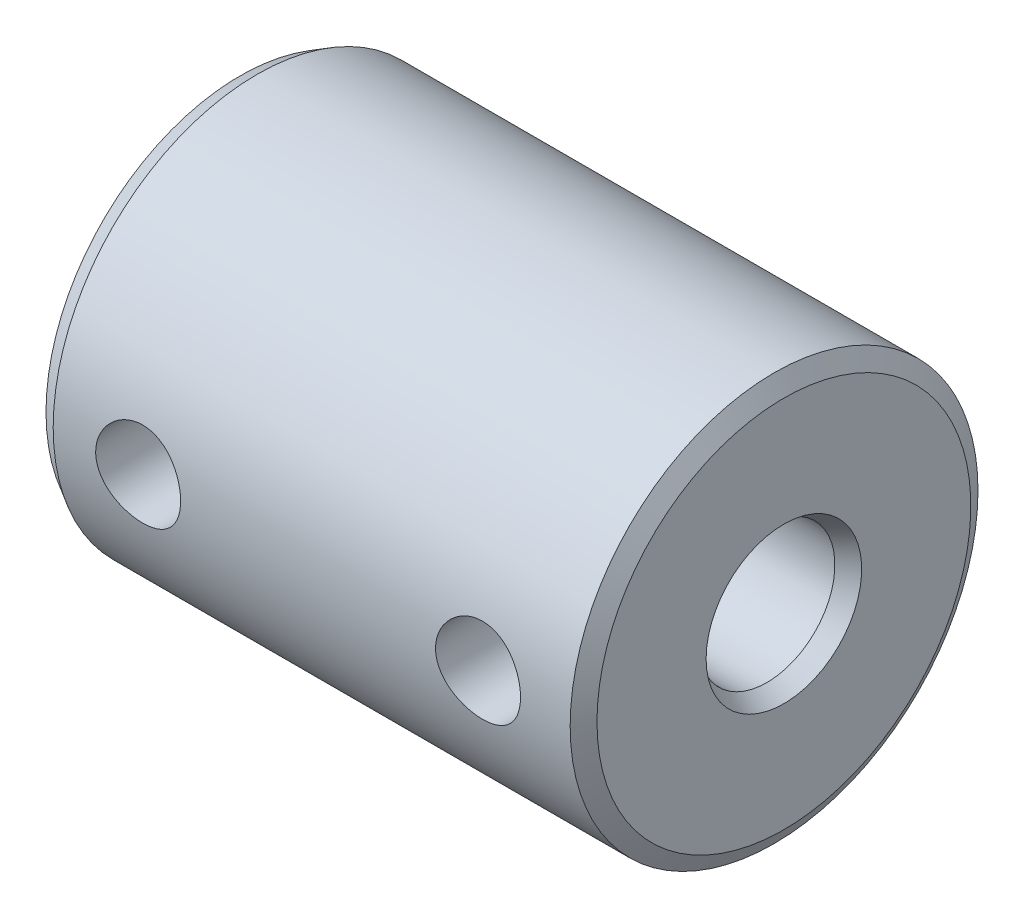
ISO-10303-21;
HEADER;
FILE_DESCRIPTION(('STEP AP214'),'2;1');
FILE_NAME('part.step','',(''),(''),'','','');
FILE_SCHEMA(('AUTOMOTIVE_DESIGN { 1 0 10303 214 1 1 1 1 }'));
ENDSEC;
DATA;
#1=APPLICATION_CONTEXT('core data for automotive mechanical design processes');
#2=APPLICATION_PROTOCOL_DEFINITION('international standard','automotive_design',2000,#1);
#3=PRODUCT_CONTEXT('',#1,'mechanical');
#4=PRODUCT('Part','Part','',(#3));
#5=PRODUCT_RELATED_PRODUCT_CATEGORY('part','',(#4));
#6=PRODUCT_DEFINITION_FORMATION('','',#4);
#7=PRODUCT_DEFINITION_CONTEXT('part definition',#1,'design');
#8=PRODUCT_DEFINITION('design','',#6,#7);
#9=PRODUCT_DEFINITION_SHAPE('','',#8);
#10=(LENGTH_UNIT() NAMED_UNIT(*) SI_UNIT(.MILLI.,.METRE.));
#11=(NAMED_UNIT(*) PLANE_ANGLE_UNIT() SI_UNIT($,.RADIAN.));
#12=(NAMED_UNIT(*) SI_UNIT($,.STERADIAN.) SOLID_ANGLE_UNIT());
#13=UNCERTAINTY_MEASURE_WITH_UNIT(LENGTH_MEASURE(1.E-05),#10,'distance_accuracy_value','');
#14=(GEOMETRIC_REPRESENTATION_CONTEXT(3) GLOBAL_UNCERTAINTY_ASSIGNED_CONTEXT((#13)) GLOBAL_UNIT_ASSIGNED_CONTEXT((#10,
#11,#12)) REPRESENTATION_CONTEXT('',''));
#15=CARTESIAN_POINT('',(0.,0.,0.));
#16=DIRECTION('',(0.,0.,1.));
#17=DIRECTION('',(1.,0.,0.));
#18=AXIS2_PLACEMENT_3D('',#15,#16,#17);
#19=CARTESIAN_POINT('',(0.,0.,0.));
#20=DIRECTION('',(-1.,0.,0.));
#21=DIRECTION('',(0.,0.,1.));
#22=AXIS2_PLACEMENT_3D('',#19,#20,#21);
#23=CYLINDRICAL_SURFACE('',#22,3.);
#24=CARTESIAN_POINT('',(4.24999999999999,0.,3.));
#25=CARTESIAN_POINT('',(4.2499927949087,0.0669580526362665,2.99999458367272));
#26=CARTESIAN_POINT('',(4.24458804147186,0.13402139706384,2.9977323297471));
#27=CARTESIAN_POINT('',(4.22316093507981,0.266247371156346,2.98890153579551));
#28=CARTESIAN_POINT('',(4.20711087553575,0.331404576423563,2.98232175901027));
#29=CARTESIAN_POINT('',(4.16508890821941,0.457688733653086,2.96556289038127));
#30=CARTESIAN_POINT('',(4.13915061053185,0.518828524426266,2.95539599975003));
#31=CARTESIAN_POINT('',(4.07822717676743,0.635829756679799,2.93245286470664));
#32=CARTESIAN_POINT('',(4.04324478102913,0.691692790015936,2.91967741092849));
#33=CARTESIAN_POINT('',(3.96337101740912,0.799448403559508,2.89207828351869));
#34=CARTESIAN_POINT('',(3.91809869121024,0.851041267517764,2.87718753326093));
#35=CARTESIAN_POINT('',(3.81973566521743,0.946159821091257,2.84732714068513));
#36=CARTESIAN_POINT('',(3.76664087510549,0.98968126315308,2.83235746106809));
#37=CARTESIAN_POINT('',(3.6509732224351,1.06953737697065,2.80321021812995));
#38=CARTESIAN_POINT('',(3.58806255157345,1.10541308153924,2.78910786873385));
#39=CARTESIAN_POINT('',(3.45642674207907,1.16593940588865,2.76435572357005));
#40=CARTESIAN_POINT('',(3.38770462051555,1.1905958083629,2.75370415000823));
#41=CARTESIAN_POINT('',(3.24984630823208,1.22674598312158,2.73778555387705));
#42=CARTESIAN_POINT('',(3.18088951660785,1.23881657877605,2.73228387651787));
#43=CARTESIAN_POINT('',(3.04172670731343,1.25125209967796,2.72661326219504));
#44=CARTESIAN_POINT('',(2.97152139997426,1.25162348054397,2.7264413842526));
#45=CARTESIAN_POINT('',(2.83759993956506,1.24108450363673,2.73125119560852));
#46=CARTESIAN_POINT('',(2.77379890343554,1.231036811123,2.73583882723623));
#47=CARTESIAN_POINT('',(2.64888790899961,1.20139191015776,2.74898482773796));
#48=CARTESIAN_POINT('',(2.58777846850823,1.18179287287176,2.75754395703563));
#49=CARTESIAN_POINT('',(2.46844229700856,1.1332195872757,2.77786184772756));
#50=CARTESIAN_POINT('',(2.41030457908662,1.10405471539235,2.78968481949136));
#51=CARTESIAN_POINT('',(2.29952226611986,1.03731242580562,2.81518331141086));
#52=CARTESIAN_POINT('',(2.24687984938649,0.999731690519539,2.82885956129779));
#53=CARTESIAN_POINT('',(2.14390004126717,0.913495965543831,2.85792976877979));
#54=CARTESIAN_POINT('',(2.09413343261457,0.864173483207522,2.87337121404472));
#55=CARTESIAN_POINT('',(2.00338649704082,0.757729591051508,2.90325673112529));
#56=CARTESIAN_POINT('',(1.96240822830783,0.700606359448453,2.9177005687701));
#57=CARTESIAN_POINT('',(1.88956417638374,0.578447948693374,2.94438283556473));
#58=CARTESIAN_POINT('',(1.85793055484932,0.513260582447678,2.95656266543333));
#59=CARTESIAN_POINT('',(1.80627886039675,0.37785240252683,2.97689481414803));
#60=CARTESIAN_POINT('',(1.78625436805619,0.307634394795034,2.985049358458));
#61=CARTESIAN_POINT('',(1.75958400787337,0.168928113346228,2.99599641186384));
#62=CARTESIAN_POINT('',(1.75217214255626,0.100611285278639,2.99909541047125));
#63=CARTESIAN_POINT('',(1.74865377638591,-0.0363546554960887,3.00056050368744));
#64=CARTESIAN_POINT('',(1.75254402974801,-0.105003667152635,2.99892795711939));
#65=CARTESIAN_POINT('',(1.77097108480607,-0.237098242341434,2.9913121765694));
#66=CARTESIAN_POINT('',(1.7849699540972,-0.300632966639385,2.98554887283989));
#67=CARTESIAN_POINT('',(1.82246819454079,-0.424382748971088,2.97048606772414));
#68=CARTESIAN_POINT('',(1.84596876595031,-0.484597386518358,2.96118611959703));
#69=CARTESIAN_POINT('',(1.90257097571212,-0.602108999869134,2.93958270645165));
#70=CARTESIAN_POINT('',(1.93594818314604,-0.659257236855321,2.92719491469281));
#71=CARTESIAN_POINT('',(2.0110533777917,-0.767346216231426,2.9007380457909));
#72=CARTESIAN_POINT('',(2.05278485152928,-0.818284352601937,2.88666826768733));
#73=CARTESIAN_POINT('',(2.14690323327241,-0.91633343027426,2.85712087895437));
#74=CARTESIAN_POINT('',(2.19983850298627,-0.962910697979831,2.84161451591029));
#75=CARTESIAN_POINT('',(2.3130212759354,-1.0466698461055,2.81184336768005));
#76=CARTESIAN_POINT('',(2.37327043517174,-1.08384959285617,2.79757886493438));
#77=CARTESIAN_POINT('',(2.50061417530258,-1.14815960208699,2.77181386243988));
#78=CARTESIAN_POINT('',(2.56779403551483,-1.17513918237328,2.76035562555111));
#79=CARTESIAN_POINT('',(2.70637059381011,-1.21717413951572,2.74208355658957));
#80=CARTESIAN_POINT('',(2.77776376248335,-1.23223934863687,2.73526589555752));
#81=CARTESIAN_POINT('',(2.91681869919921,-1.249040803489,2.72763164537264));
#82=CARTESIAN_POINT('',(2.98434466229262,-1.25171380413129,2.72639350967163));
#83=CARTESIAN_POINT('',(3.1188428611411,-1.24615575523912,2.72893853011024));
#84=CARTESIAN_POINT('',(3.18581518031369,-1.23792637964721,2.73272091540306));
#85=CARTESIAN_POINT('',(3.31409274746889,-1.21158404780491,2.74449551302268));
#86=CARTESIAN_POINT('',(3.37551667346339,-1.19394903571465,2.7522835484648));
#87=CARTESIAN_POINT('',(3.49454802135723,-1.14976328202134,2.77103181199189));
#88=CARTESIAN_POINT('',(3.55215436539878,-1.12321003517251,2.78199293131693));
#89=CARTESIAN_POINT('',(3.66569589594912,-1.06010285935489,2.80666954560013));
#90=CARTESIAN_POINT('',(3.72132233016829,-1.02304360910483,2.82051102713679));
#91=CARTESIAN_POINT('',(3.82586013936068,-0.940684072630385,2.84903689053839));
#92=CARTESIAN_POINT('',(3.87476917560057,-0.895380928905613,2.86372156345875));
#93=CARTESIAN_POINT('',(3.96814868168474,-0.793902045778815,2.89356392850106));
#94=CARTESIAN_POINT('',(4.01203643284065,-0.737174739949022,2.90867817511791));
#95=CARTESIAN_POINT('',(4.08969945354362,-0.616600079253194,2.9366014362202));
#96=CARTESIAN_POINT('',(4.12347011488955,-0.552749497945741,2.9494093991674));
#97=CARTESIAN_POINT('',(4.17920984543988,-0.420732056717947,2.9710918336246));
#98=CARTESIAN_POINT('',(4.20136476661729,-0.352653990980632,2.98002782581963));
#99=CARTESIAN_POINT('',(4.23370632907783,-0.213410421846556,2.99321009768624));
#100=CARTESIAN_POINT('',(4.24393044252988,-0.142255316980955,2.99747105811966));
#101=CARTESIAN_POINT('',(4.24933316108644,-0.047236081919182,2.99972287568933));
#102=CARTESIAN_POINT('',(4.25000254214922,-0.0236245946756565,3.00000191102535));
#103=CARTESIAN_POINT('',(4.24999999999999,0.,3.));
#104=B_SPLINE_CURVE_WITH_KNOTS('',3,(#24,#25,#26,#27,#28,#29,#30,#31,#32,#33,#34,#35,#36,#37,
#38,#39,#40,#41,#42,#43,#44,#45,#46,#47,#48,#49,#50,#51,#52,#53,#54,#55,#56,#57,#58,#59,#60,#61,
#62,#63,#64,#65,#66,#67,#68,#69,#70,#71,#72,#73,#74,#75,#76,#77,#78,#79,#80,#81,#82,#83,#84,#85,
#86,#87,#88,#89,#90,#91,#92,#93,#94,#95,#96,#97,#98,#99,#100,#101,#102,#103),.UNSPECIFIED.,.T.,
.F.,(4,2,2,2,2,2,2,2,2,2,2,2,2,2,2,2,2,2,2,2,2,2,2,2,2,2,2,2,2,2,2,2,2,2,2,2,2,2,2,4),(0.,
0.200806918883938,0.402138540628694,0.602791851906298,0.80338443685297,1.01317936288806,
1.22308438131465,1.44331724539125,1.66343646730587,1.87295273137557,2.08235338249045,
2.27570157202555,2.46908679727211,2.66658713058713,2.86416545717205,3.07844141127895,
3.29276749314586,3.51204055060811,3.73119224218295,3.93648443393249,4.1417176749317,
4.33676589735719,4.53183876601783,4.73297135272159,4.93418805469493,5.14978488029292,
5.36543061240339,5.58414788359521,5.80268447074578,6.00439877559641,6.20608211297533,
6.3983764996476,6.59072494950609,6.79463893397438,6.99862373425941,7.21746535004886,
7.43640649428579,7.65172855819382,7.86637250469318,7.93722256499094),.UNSPECIFIED.);
#105=CARTESIAN_POINT('',(4.24999999999999,0.,3.));
#106=VERTEX_POINT('',#105);
#107=EDGE_CURVE('E84',#106,#106,#104,.T.);
#108=ORIENTED_EDGE('',*,*,#107,.T.);
#109=EDGE_LOOP('',(#108));
#110=FACE_BOUND('',#109,.T.);
#111=CARTESIAN_POINT('',(0.288675134594811,0.,0.));
#112=DIRECTION('',(1.,0.,0.));
#113=DIRECTION('',(0.,0.,-1.));
#114=AXIS2_PLACEMENT_3D('',#111,#112,#113);
#115=CIRCLE('',#114,3.);
#116=CARTESIAN_POINT('',(0.288675134594811,0.,-3.));
#117=VERTEX_POINT('',#116);
#118=EDGE_CURVE('E117',#117,#117,#115,.F.);
#119=ORIENTED_EDGE('',*,*,#118,.T.);
#120=EDGE_LOOP('',(#119));
#121=FACE_BOUND('',#120,.T.);
#122=CARTESIAN_POINT('',(8.,0.,0.));
#123=DIRECTION('',(-1.,0.,0.));
#124=DIRECTION('',(0.,0.,1.));
#125=AXIS2_PLACEMENT_3D('',#122,#123,#124);
#126=CIRCLE('',#125,3.);
#127=CARTESIAN_POINT('',(8.,0.,3.));
#128=VERTEX_POINT('',#127);
#129=EDGE_CURVE('E83',#128,#128,#126,.T.);
#130=ORIENTED_EDGE('',*,*,#129,.F.);
#131=EDGE_LOOP('',(#130));
#132=FACE_BOUND('',#131,.T.);
#133=ADVANCED_FACE('F34',(#110,#121,#132),#23,.F.);
#134=CARTESIAN_POINT('',(0.,3.,0.));
#135=DIRECTION('',(1.,0.,0.));
#136=DIRECTION('',(0.,0.,-1.));
#137=AXIS2_PLACEMENT_3D('',#134,#135,#136);
#138=PLANE('',#137);
#139=CARTESIAN_POINT('',(0.,0.,0.));
#140=DIRECTION('',(1.,0.,0.));
#141=DIRECTION('',(0.,0.,-1.));
#142=AXIS2_PLACEMENT_3D('',#139,#140,#141);
#143=CIRCLE('',#142,3.5);
#144=CARTESIAN_POINT('',(0.,0.,-3.5));
#145=VERTEX_POINT('',#144);
#146=EDGE_CURVE('E131',#145,#145,#143,.T.);
#147=ORIENTED_EDGE('',*,*,#146,.T.);
#148=EDGE_LOOP('',(#147));
#149=FACE_BOUND('',#148,.T.);
#150=CARTESIAN_POINT('',(0.,0.,0.));
#151=DIRECTION('',(1.,0.,0.));
#152=DIRECTION('',(0.,0.,-1.));
#153=AXIS2_PLACEMENT_3D('',#150,#151,#152);
#154=CIRCLE('',#153,5.71132486540519);
#155=CARTESIAN_POINT('',(0.,0.,-5.71132486540519));
#156=VERTEX_POINT('',#155);
#157=EDGE_CURVE('E125',#156,#156,#154,.F.);
#158=ORIENTED_EDGE('',*,*,#157,.T.);
#159=EDGE_LOOP('',(#158));
#160=FACE_BOUND('',#159,.T.);
#161=ADVANCED_FACE('F102',(#149,#160),#138,.F.);
#162=CARTESIAN_POINT('',(0.,0.,0.));
#163=DIRECTION('',(-1.,0.,0.));
#164=DIRECTION('',(0.,0.,1.));
#165=AXIS2_PLACEMENT_3D('',#162,#163,#164);
#166=CYLINDRICAL_SURFACE('',#165,6.);
#167=CARTESIAN_POINT('',(1.75000000000001,0.,6.));
#168=CARTESIAN_POINT('',(1.75000247746923,0.0694090417016603,5.99999871526651));
#169=CARTESIAN_POINT('',(1.75580066571876,0.138848789520875,5.99878328775043));
#170=CARTESIAN_POINT('',(1.77881934953286,0.275761316266992,5.99405200990679));
#171=CARTESIAN_POINT('',(1.79604852303694,0.343232560128311,5.99053441189248));
#172=CARTESIAN_POINT('',(1.84137045492183,0.474209132291339,5.98159109196201));
#173=CARTESIAN_POINT('',(1.86945239599889,0.537718336709182,5.97616727052645));
#174=CARTESIAN_POINT('',(1.93564960885619,0.659120328605955,5.96399927809858));
#175=CARTESIAN_POINT('',(1.97376443115584,0.717013367534323,5.95725516625975));
#176=CARTESIAN_POINT('',(2.05953634019065,0.826390324308832,5.9430770002465));
#177=CARTESIAN_POINT('',(2.10731200123509,0.87778024416268,5.93563505848531));
#178=CARTESIAN_POINT('',(2.21079465919511,0.971877776769387,5.92095657692448));
#179=CARTESIAN_POINT('',(2.26650231187227,1.01458467096098,5.91372005416683));
#180=CARTESIAN_POINT('',(2.38495196876616,1.09051031677216,5.90019442595308));
#181=CARTESIAN_POINT('',(2.44775838450275,1.1236305468065,5.89391545174828));
#182=CARTESIAN_POINT('',(2.57819745177276,1.17881119348063,5.8831284065002));
#183=CARTESIAN_POINT('',(2.64582958244254,1.20087280167641,5.87862014467568));
#184=CARTESIAN_POINT('',(2.78298523741564,1.23300240133736,5.87196500986122));
#185=CARTESIAN_POINT('',(2.85246835933477,1.24323597696798,5.86978556855865));
#186=CARTESIAN_POINT('',(2.99219684286263,1.25193357655614,5.86793690716491));
#187=CARTESIAN_POINT('',(3.0624421188653,1.25039890894686,5.86826740800981));
#188=CARTESIAN_POINT('',(3.20048102797518,1.23573719037196,5.87137174319175));
#189=CARTESIAN_POINT('',(3.26829597966121,1.2228010523272,5.87410533679901));
#190=CARTESIAN_POINT('',(3.40077150964492,1.18600543529945,5.88164437615942));
#191=CARTESIAN_POINT('',(3.46543192560633,1.16214539481381,5.88644992841317));
#192=CARTESIAN_POINT('',(3.59030722841598,1.10400003213928,5.89763191464102));
#193=CARTESIAN_POINT('',(3.65048629652707,1.06964002534236,5.90401953785585));
#194=CARTESIAN_POINT('',(3.76429574426816,0.991522699274812,5.91763890010721));
#195=CARTESIAN_POINT('',(3.81792530883597,0.947764212262582,5.92487074398537));
#196=CARTESIAN_POINT('',(3.91821396108037,0.851074921546778,5.93953730929908));
#197=CARTESIAN_POINT('',(3.96471616889701,0.797981433412078,5.94697323199473));
#198=CARTESIAN_POINT('',(4.04818044222897,0.684667288611794,5.96108088143001));
#199=CARTESIAN_POINT('',(4.08514236459839,0.624446525025762,5.96775259670236));
#200=CARTESIAN_POINT('',(4.14851008153595,0.498405541235476,5.97959870942815));
#201=CARTESIAN_POINT('',(4.17489680456711,0.432575461926497,5.98477039710258));
#202=CARTESIAN_POINT('',(4.21619170483549,0.297284620972153,5.99301338211281));
#203=CARTESIAN_POINT('',(4.23110139323139,0.227824338595088,5.99608495596053));
#204=CARTESIAN_POINT('',(4.24879425206788,0.0885918657008343,5.99974275215455));
#205=CARTESIAN_POINT('',(4.25179194149424,0.0188480555261782,6.00037293537579));
#206=CARTESIAN_POINT('',(4.24615505003089,-0.120143798757714,5.99919952252773));
#207=CARTESIAN_POINT('',(4.2375211813984,-0.189391872962257,5.99739607548153));
#208=CARTESIAN_POINT('',(4.20904434653046,-0.324726367119812,5.99158564979184));
#209=CARTESIAN_POINT('',(4.18931251461653,-0.390837192894204,5.98760052868077));
#210=CARTESIAN_POINT('',(4.13932213957859,-0.518811446661328,5.97787227242394));
#211=CARTESIAN_POINT('',(4.10906275913401,-0.580674536336772,5.97212899744578));
#212=CARTESIAN_POINT('',(4.03841962176244,-0.69929430694349,5.95941241490714));
#213=CARTESIAN_POINT('',(3.99790807043093,-0.75597321946983,5.9524239381233));
#214=CARTESIAN_POINT('',(3.90808043692372,-0.861805445886515,5.93802568299709));
#215=CARTESIAN_POINT('',(3.85876332448106,-0.910957877913281,5.93061585542511));
#216=CARTESIAN_POINT('',(3.7517444230003,-1.0011786486518,5.91606024531377));
#217=CARTESIAN_POINT('',(3.69391696804471,-1.04209914600204,5.90892089307501));
#218=CARTESIAN_POINT('',(3.57208371578621,-1.11364719079243,5.89585601015805));
#219=CARTESIAN_POINT('',(3.50807817586089,-1.14427516677863,5.88993042894651));
#220=CARTESIAN_POINT('',(3.37603880370177,-1.19417246443922,5.88001700708041));
#221=CARTESIAN_POINT('',(3.30802896283416,-1.21350309828031,5.87601872784687));
#222=CARTESIAN_POINT('',(3.16963344950774,-1.24044038523407,5.87039184709697));
#223=CARTESIAN_POINT('',(3.09924811838056,-1.2480487154444,5.86876290660367));
#224=CARTESIAN_POINT('',(2.95958659900035,-1.25125926487611,5.86807907308506));
#225=CARTESIAN_POINT('',(2.89031592977795,-1.24709542622725,5.86897402321502));
#226=CARTESIAN_POINT('',(2.75348599107978,-1.22739905314031,5.87312447254927));
#227=CARTESIAN_POINT('',(2.6859267051839,-1.21186662782265,5.87637994909626));
#228=CARTESIAN_POINT('',(2.55460222810934,-1.16998217768584,5.88486132447716));
#229=CARTESIAN_POINT('',(2.49082675351308,-1.14366117568421,5.8900815700793));
#230=CARTESIAN_POINT('',(2.36856122397334,-1.08097457299757,5.90190705738738));
#231=CARTESIAN_POINT('',(2.31007166036688,-1.04460803983029,5.9085124276546));
#232=CARTESIAN_POINT('',(2.19887837292056,-0.962073695342405,5.92251579551146));
#233=CARTESIAN_POINT('',(2.14630087543502,-0.91573789041822,5.92992613868404));
#234=CARTESIAN_POINT('',(2.04959050677365,-0.814924438115329,5.94461839583212));
#235=CARTESIAN_POINT('',(2.00545958244852,-0.760444918832963,5.95190027984879));
#236=CARTESIAN_POINT('',(1.92641142681595,-0.644134427507699,5.96561444547637));
#237=CARTESIAN_POINT('',(1.89160632011372,-0.582225921521345,5.97203596073244));
#238=CARTESIAN_POINT('',(1.83294977156998,-0.453319843998451,5.98319908494092));
#239=CARTESIAN_POINT('',(1.80908875281813,-0.386326781907242,5.98794216182101));
#240=CARTESIAN_POINT('',(1.77745972171158,-0.266015292900104,5.99432499781443));
#241=CARTESIAN_POINT('',(1.76718123679115,-0.213367593727928,5.99644035661395));
#242=CARTESIAN_POINT('',(1.75345054572268,-0.107152674176536,5.99927832789758));
#243=CARTESIAN_POINT('',(1.74999808733281,-0.0535854878488715,6.00000099184586));
#244=CARTESIAN_POINT('',(1.75000000000001,0.,6.));
#245=B_SPLINE_CURVE_WITH_KNOTS('',3,(#167,#168,#169,#170,#171,#172,#173,#174,#175,#176,#177,
#178,#179,#180,#181,#182,#183,#184,#185,#186,#187,#188,#189,#190,#191,#192,#193,#194,#195,#196,
#197,#198,#199,#200,#201,#202,#203,#204,#205,#206,#207,#208,#209,#210,#211,#212,#213,#214,#215,
#216,#217,#218,#219,#220,#221,#222,#223,#224,#225,#226,#227,#228,#229,#230,#231,#232,#233,#234,
#235,#236,#237,#238,#239,#240,#241,#242,#243,#244),.UNSPECIFIED.,.T.,.F.,(4,2,2,2,2,2,2,2,2,2,2,
2,2,2,2,2,2,2,2,2,2,2,2,2,2,2,2,2,2,2,2,2,2,2,2,2,2,2,4),(0.,0.208031045103182,
0.416220199906223,0.624202378825439,0.832175241572985,1.04287526388122,1.25359271551785,
1.46640449178548,1.67919333285489,1.88896575169853,2.09871484767163,2.30501712129058,
2.51133000030278,2.71914592416748,2.92698768368033,3.13889526355464,3.35080602278216,
3.56309724499661,3.77536051045769,3.98378339407673,4.19219351552275,4.39855286632619,
4.60492863390931,4.81401583995734,5.02312752564571,5.23571263829334,5.44828889851306,
5.65970050095022,5.87108185414182,6.07829223291035,6.28550062281358,6.49211731393252,
6.69875319081477,6.90919024830305,7.11967575117366,7.33258864398252,7.54531486464969,
7.70592588477276,7.86653096973387),.UNSPECIFIED.);
#246=CARTESIAN_POINT('',(1.75000000000001,0.,6.));
#247=VERTEX_POINT('',#246);
#248=EDGE_CURVE('E10',#247,#247,#245,.T.);
#249=ORIENTED_EDGE('',*,*,#248,.T.);
#250=EDGE_LOOP('',(#249));
#251=FACE_BOUND('',#250,.T.);
#252=CARTESIAN_POINT('',(11.75,0.,6.));
#253=CARTESIAN_POINT('',(11.7500024774692,0.0694090417016603,5.99999871526651));
#254=CARTESIAN_POINT('',(11.7558006657188,0.138848789520875,5.99878328775043));
#255=CARTESIAN_POINT('',(11.7788193495329,0.275761316266992,5.99405200990679));
#256=CARTESIAN_POINT('',(11.7960485230369,0.343232560128311,5.99053441189248));
#257=CARTESIAN_POINT('',(11.8413704549218,0.474209132291339,5.98159109196201));
#258=CARTESIAN_POINT('',(11.8694523959989,0.537718336709182,5.97616727052645));
#259=CARTESIAN_POINT('',(11.9356496088562,0.659120328605954,5.96399927809858));
#260=CARTESIAN_POINT('',(11.9737644311558,0.717013367534323,5.95725516625975));
#261=CARTESIAN_POINT('',(12.0595363401906,0.826390324308831,5.9430770002465));
#262=CARTESIAN_POINT('',(12.1073120012351,0.877780244162679,5.93563505848531));
#263=CARTESIAN_POINT('',(12.2107946591951,0.971877776769386,5.92095657692448));
#264=CARTESIAN_POINT('',(12.2665023118723,1.01458467096098,5.91372005416683));
#265=CARTESIAN_POINT('',(12.3849519687662,1.09051031677216,5.90019442595308));
#266=CARTESIAN_POINT('',(12.4477583845027,1.1236305468065,5.89391545174828));
#267=CARTESIAN_POINT('',(12.5781974517728,1.17881119348063,5.8831284065002));
#268=CARTESIAN_POINT('',(12.6458295824425,1.20087280167641,5.87862014467568));
#269=CARTESIAN_POINT('',(12.7829852374156,1.23300240133736,5.87196500986122));
#270=CARTESIAN_POINT('',(12.8524683593348,1.24323597696798,5.86978556855865));
#271=CARTESIAN_POINT('',(12.9921968428626,1.25193357655614,5.86793690716491));
#272=CARTESIAN_POINT('',(13.0624421188653,1.25039890894686,5.86826740800981));
#273=CARTESIAN_POINT('',(13.2004810279752,1.23573719037196,5.87137174319175));
#274=CARTESIAN_POINT('',(13.2682959796612,1.2228010523272,5.87410533679901));
#275=CARTESIAN_POINT('',(13.4007715096449,1.18600543529945,5.88164437615942));
#276=CARTESIAN_POINT('',(13.4654319256063,1.16214539481381,5.88644992841317));
#277=CARTESIAN_POINT('',(13.590307228416,1.10400003213928,5.89763191464102));
#278=CARTESIAN_POINT('',(13.6504862965271,1.06964002534236,5.90401953785585));
#279=CARTESIAN_POINT('',(13.7642957442682,0.991522699274812,5.91763890010721));
#280=CARTESIAN_POINT('',(13.817925308836,0.947764212262582,5.92487074398537));
#281=CARTESIAN_POINT('',(13.9182139610804,0.851074921546778,5.93953730929908));
#282=CARTESIAN_POINT('',(13.964716168897,0.797981433412078,5.94697323199473));
#283=CARTESIAN_POINT('',(14.048180442229,0.684667288611794,5.96108088143001));
#284=CARTESIAN_POINT('',(14.0851423645984,0.624446525025762,5.96775259670236));
#285=CARTESIAN_POINT('',(14.1485100815359,0.498405541235475,5.97959870942815));
#286=CARTESIAN_POINT('',(14.1748968045671,0.432575461926497,5.98477039710258));
#287=CARTESIAN_POINT('',(14.2161917048355,0.297284620972153,5.9930133821128));
#288=CARTESIAN_POINT('',(14.2311013932314,0.227824338595088,5.99608495596053));
#289=CARTESIAN_POINT('',(14.2487942520679,0.0885918657008344,5.99974275215455));
#290=CARTESIAN_POINT('',(14.2517919414942,0.0188480555261784,6.00037293537579));
#291=CARTESIAN_POINT('',(14.2461550500309,-0.120143798757714,5.99919952252773));
#292=CARTESIAN_POINT('',(14.2375211813984,-0.189391872962257,5.99739607548153));
#293=CARTESIAN_POINT('',(14.2090443465305,-0.324726367119812,5.99158564979184));
#294=CARTESIAN_POINT('',(14.1893125146165,-0.390837192894205,5.98760052868077));
#295=CARTESIAN_POINT('',(14.1393221395786,-0.518811446661329,5.97787227242394));
#296=CARTESIAN_POINT('',(14.109062759134,-0.580674536336773,5.97212899744578));
#297=CARTESIAN_POINT('',(14.0384196217624,-0.69929430694349,5.95941241490714));
#298=CARTESIAN_POINT('',(13.9979080704309,-0.755973219469829,5.9524239381233));
#299=CARTESIAN_POINT('',(13.9080804369237,-0.861805445886514,5.93802568299709));
#300=CARTESIAN_POINT('',(13.8587633244811,-0.910957877913281,5.93061585542511));
#301=CARTESIAN_POINT('',(13.7517444230003,-1.0011786486518,5.91606024531377));
#302=CARTESIAN_POINT('',(13.6939169680447,-1.04209914600204,5.90892089307501));
#303=CARTESIAN_POINT('',(13.5720837157862,-1.11364719079243,5.89585601015805));
#304=CARTESIAN_POINT('',(13.5080781758609,-1.14427516677863,5.88993042894651));
#305=CARTESIAN_POINT('',(13.3760388037018,-1.19417246443921,5.88001700708041));
#306=CARTESIAN_POINT('',(13.3080289628342,-1.21350309828031,5.87601872784687));
#307=CARTESIAN_POINT('',(13.1696334495077,-1.24044038523407,5.87039184709697));
#308=CARTESIAN_POINT('',(13.0992481183806,-1.2480487154444,5.86876290660367));
#309=CARTESIAN_POINT('',(12.9595865990003,-1.25125926487611,5.86807907308506));
#310=CARTESIAN_POINT('',(12.8903159297779,-1.24709542622725,5.86897402321502));
#311=CARTESIAN_POINT('',(12.7534859910798,-1.22739905314031,5.87312447254927));
#312=CARTESIAN_POINT('',(12.6859267051839,-1.21186662782265,5.87637994909626));
#313=CARTESIAN_POINT('',(12.5546022281093,-1.16998217768584,5.88486132447716));
#314=CARTESIAN_POINT('',(12.4908267535131,-1.14366117568421,5.8900815700793));
#315=CARTESIAN_POINT('',(12.3685612239733,-1.08097457299757,5.90190705738738));
#316=CARTESIAN_POINT('',(12.3100716603669,-1.04460803983029,5.9085124276546));
#317=CARTESIAN_POINT('',(12.1988783729206,-0.962073695342404,5.92251579551146));
#318=CARTESIAN_POINT('',(12.146300875435,-0.91573789041822,5.92992613868404));
#319=CARTESIAN_POINT('',(12.0495905067736,-0.814924438115329,5.94461839583212));
#320=CARTESIAN_POINT('',(12.0054595824485,-0.760444918832963,5.95190027984879));
#321=CARTESIAN_POINT('',(11.9264114268159,-0.644134427507699,5.96561444547637));
#322=CARTESIAN_POINT('',(11.8916063201137,-0.582225921521345,5.97203596073244));
#323=CARTESIAN_POINT('',(11.83294977157,-0.453319843998451,5.98319908494092));
#324=CARTESIAN_POINT('',(11.8090887528181,-0.386326781907241,5.98794216182101));
#325=CARTESIAN_POINT('',(11.7774597217116,-0.266015292900103,5.99432499781443));
#326=CARTESIAN_POINT('',(11.7671812367911,-0.213367593727927,5.99644035661395));
#327=CARTESIAN_POINT('',(11.7534505457227,-0.107152674176536,5.99927832789758));
#328=CARTESIAN_POINT('',(11.7499980873328,-0.0535854878488714,6.00000099184586));
#329=CARTESIAN_POINT('',(11.75,0.,6.));
#330=B_SPLINE_CURVE_WITH_KNOTS('',3,(#252,#253,#254,#255,#256,#257,#258,#259,#260,#261,#262,
#263,#264,#265,#266,#267,#268,#269,#270,#271,#272,#273,#274,#275,#276,#277,#278,#279,#280,#281,
#282,#283,#284,#285,#286,#287,#288,#289,#290,#291,#292,#293,#294,#295,#296,#297,#298,#299,#300,
#301,#302,#303,#304,#305,#306,#307,#308,#309,#310,#311,#312,#313,#314,#315,#316,#317,#318,#319,
#320,#321,#322,#323,#324,#325,#326,#327,#328,#329),.UNSPECIFIED.,.T.,.F.,(4,2,2,2,2,2,2,2,2,2,2,
2,2,2,2,2,2,2,2,2,2,2,2,2,2,2,2,2,2,2,2,2,2,2,2,2,2,2,4),(0.,0.208031045103182,
0.416220199906223,0.624202378825439,0.832175241572985,1.04287526388122,1.25359271551785,
1.46640449178548,1.67919333285489,1.88896575169853,2.09871484767163,2.30501712129058,
2.51133000030278,2.71914592416748,2.92698768368033,3.13889526355464,3.35080602278216,
3.5630972449966,3.77536051045769,3.98378339407673,4.19219351552275,4.39855286632619,
4.60492863390931,4.81401583995734,5.02312752564571,5.23571263829333,5.44828889851306,
5.65970050095022,5.87108185414182,6.07829223291035,6.28550062281357,6.49211731393252,
6.69875319081476,6.90919024830305,7.11967575117365,7.33258864398252,7.54531486464969,
7.70592588477276,7.86653096973387),.UNSPECIFIED.);
#331=CARTESIAN_POINT('',(11.75,0.,6.));
#332=VERTEX_POINT('',#331);
#333=EDGE_CURVE('E46',#332,#332,#330,.T.);
#334=ORIENTED_EDGE('',*,*,#333,.T.);
#335=EDGE_LOOP('',(#334));
#336=FACE_BOUND('',#335,.T.);
#337=CARTESIAN_POINT('',(0.500000000000002,0.,0.));
#338=DIRECTION('',(1.,0.,0.));
#339=DIRECTION('',(0.,0.,-1.));
#340=AXIS2_PLACEMENT_3D('',#337,#338,#339);
#341=CIRCLE('',#340,6.);
#342=CARTESIAN_POINT('',(0.500000000000002,0.,-6.));
#343=VERTEX_POINT('',#342);
#344=EDGE_CURVE('E137',#343,#343,#341,.T.);
#345=ORIENTED_EDGE('',*,*,#344,.T.);
#346=EDGE_LOOP('',(#345));
#347=FACE_BOUND('',#346,.T.);
#348=CARTESIAN_POINT('',(15.7113248654052,0.,0.));
#349=DIRECTION('',(-1.,0.,0.));
#350=DIRECTION('',(0.,0.,1.));
#351=AXIS2_PLACEMENT_3D('',#348,#349,#350);
#352=CIRCLE('',#351,6.);
#353=CARTESIAN_POINT('',(15.7113248654052,0.,6.));
#354=VERTEX_POINT('',#353);
#355=EDGE_CURVE('E134',#354,#354,#352,.T.);
#356=ORIENTED_EDGE('',*,*,#355,.T.);
#357=EDGE_LOOP('',(#356));
#358=FACE_BOUND('',#357,.T.);
#359=ADVANCED_FACE('F61',(#251,#336,#347,#358),#166,.T.);
#360=CARTESIAN_POINT('',(16.,6.,0.));
#361=DIRECTION('',(-1.,0.,0.));
#362=DIRECTION('',(0.,0.,1.));
#363=AXIS2_PLACEMENT_3D('',#360,#361,#362);
#364=PLANE('',#363);
#365=CARTESIAN_POINT('',(16.,0.,0.));
#366=DIRECTION('',(-1.,0.,0.));
#367=DIRECTION('',(0.,0.,1.));
#368=AXIS2_PLACEMENT_3D('',#365,#366,#367);
#369=CIRCLE('',#368,5.5);
#370=CARTESIAN_POINT('',(16.,0.,5.5));
#371=VERTEX_POINT('',#370);
#372=EDGE_CURVE('E54',#371,#371,#369,.F.);
#373=ORIENTED_EDGE('',*,*,#372,.T.);
#374=EDGE_LOOP('',(#373));
#375=FACE_BOUND('',#374,.T.);
#376=CARTESIAN_POINT('',(16.,0.,0.));
#377=DIRECTION('',(-1.,0.,0.));
#378=DIRECTION('',(0.,0.,1.));
#379=AXIS2_PLACEMENT_3D('',#376,#377,#378);
#380=CIRCLE('',#379,2.28867513459481);
#381=CARTESIAN_POINT('',(16.,0.,2.28867513459481));
#382=VERTEX_POINT('',#381);
#383=EDGE_CURVE('E140',#382,#382,#380,.T.);
#384=ORIENTED_EDGE('',*,*,#383,.T.);
#385=EDGE_LOOP('',(#384));
#386=FACE_BOUND('',#385,.T.);
#387=ADVANCED_FACE('F94',(#375,#386),#364,.F.);
#388=CARTESIAN_POINT('',(0.,0.,0.));
#389=DIRECTION('',(-1.,0.,0.));
#390=DIRECTION('',(0.,0.,1.));
#391=AXIS2_PLACEMENT_3D('',#388,#389,#390);
#392=CYLINDRICAL_SURFACE('',#391,1.99999999999999);
#393=CARTESIAN_POINT('',(14.25,0.,1.99999999999999));
#394=CARTESIAN_POINT('',(14.2499956500012,0.0635104730002022,1.99999595305312));
#395=CARTESIAN_POINT('',(14.2451269881822,0.127096441053757,1.99694323311));
#396=CARTESIAN_POINT('',(14.2259141965705,0.252318262265281,1.98502167724102));
#397=CARTESIAN_POINT('',(14.2115520060745,0.313950163299071,1.97614175574895));
#398=CARTESIAN_POINT('',(14.1741886368379,0.43320555813678,1.95345852982134));
#399=CARTESIAN_POINT('',(14.1512302121591,0.490847243665014,1.93967960778662));
#400=CARTESIAN_POINT('',(14.0976141492032,0.601260368868357,1.90834598486073));
#401=CARTESIAN_POINT('',(14.0669573639908,0.654032347276148,1.89079170235271));
#402=CARTESIAN_POINT('',(13.996113426815,0.757974192167969,1.85170152902273));
#403=CARTESIAN_POINT('',(13.9553607000245,0.808679560769972,1.82995962224617));
#404=CARTESIAN_POINT('',(13.8667808254934,0.902986375146754,1.78531349913631));
#405=CARTESIAN_POINT('',(13.8189441717421,0.946578107215728,1.76240774858553));
#406=CARTESIAN_POINT('',(13.7099661057955,1.03142873237132,1.71430418655198));
#407=CARTESIAN_POINT('',(13.6479002133927,1.0715720602915,1.68921610993412));
#408=CARTESIAN_POINT('',(13.5164351845528,1.14073966020039,1.64330198128731));
#409=CARTESIAN_POINT('',(13.4470486874239,1.16978270899534,1.62246875996238));
#410=CARTESIAN_POINT('',(13.3211894762213,1.2093340058598,1.59309575627364));
#411=CARTESIAN_POINT('',(13.2660331814612,1.22269552371393,1.58276905990074));
#412=CARTESIAN_POINT('',(13.1536940743892,1.24181843585479,1.56781357325805));
#413=CARTESIAN_POINT('',(13.0965142417255,1.24759056342087,1.56317673673692));
#414=CARTESIAN_POINT('',(12.9815869832489,1.25118918245719,1.56029885782827));
#415=CARTESIAN_POINT('',(12.9238384635376,1.2489948372785,1.56207458771718));
#416=CARTESIAN_POINT('',(12.809689896811,1.23676317046804,1.5717740238392));
#417=CARTESIAN_POINT('',(12.7532909679609,1.22671956265043,1.5797026576711));
#418=CARTESIAN_POINT('',(12.6445615473425,1.19968103371473,1.60032573121781));
#419=CARTESIAN_POINT('',(12.5921675443157,1.18285016736896,1.61290715104814));
#420=CARTESIAN_POINT('',(12.4908388175946,1.14290189820937,1.64145566443406));
#421=CARTESIAN_POINT('',(12.4419053251255,1.11978227193695,1.65742395501353));
#422=CARTESIAN_POINT('',(12.3391667261673,1.06294892954948,1.69454815993019));
#423=CARTESIAN_POINT('',(12.2861591898796,1.0280629660117,1.71611591575959));
#424=CARTESIAN_POINT('',(12.1861697209995,0.950881463002096,1.76005711791243));
#425=CARTESIAN_POINT('',(12.1391940682935,0.908578308011433,1.78243137335975));
#426=CARTESIAN_POINT('',(12.0446982506296,0.809519713023328,1.82979894916856));
#427=CARTESIAN_POINT('',(11.9983670257412,0.751531353595329,1.85461531676593));
#428=CARTESIAN_POINT('',(11.9161491041128,0.627148099593566,1.90028055062444));
#429=CARTESIAN_POINT('',(11.8802583022711,0.560756523881996,1.92113097514763));
#430=CARTESIAN_POINT('',(11.8222363116186,0.424883562934746,1.95553372961316));
#431=CARTESIAN_POINT('',(11.7994659600188,0.355763457732369,1.96941976591574));
#432=CARTESIAN_POINT('',(11.7662350720172,0.213612154574975,1.98984929310048));
#433=CARTESIAN_POINT('',(11.755757105778,0.140586648341304,1.99640317990069));
#434=CARTESIAN_POINT('',(11.7484341499388,0.004515618740589,2.00097840540091));
#435=CARTESIAN_POINT('',(11.7497968220462,-0.0584027741637843,2.0001216134551));
#436=CARTESIAN_POINT('',(11.7618828284207,-0.182972117996308,1.99258901494326));
#437=CARTESIAN_POINT('',(11.7726055250922,-0.244623154962732,1.98591360473591));
#438=CARTESIAN_POINT('',(11.802238536692,-0.362521070658187,1.96774052283069));
#439=CARTESIAN_POINT('',(11.8208121567967,-0.418885009953202,1.95644170526843));
#440=CARTESIAN_POINT('',(11.8652963892786,-0.527638281070985,1.92995684104751));
#441=CARTESIAN_POINT('',(11.8912082302552,-0.580026945470711,1.91477014350266));
#442=CARTESIAN_POINT('',(11.9525152059955,-0.685084056277252,1.87990012356));
#443=CARTESIAN_POINT('',(11.9886035692382,-0.737246967843399,1.85991764817224));
#444=CARTESIAN_POINT('',(12.0677938651528,-0.835142640217335,1.81806970001716));
#445=CARTESIAN_POINT('',(12.1109035892545,-0.880868151291848,1.79620214826384));
#446=CARTESIAN_POINT('',(12.2101350394127,-0.971474198022877,1.74905869713091));
#447=CARTESIAN_POINT('',(12.2672372062948,-1.01526851939752,1.72374883414957));
#448=CARTESIAN_POINT('',(12.3888757849443,-1.09280351885683,1.67566762748172));
#449=CARTESIAN_POINT('',(12.453407006753,-1.12655115718693,1.65289453322336));
#450=CARTESIAN_POINT('',(12.5746921480569,-1.17684772011827,1.61733530314592));
#451=CARTESIAN_POINT('',(12.6302407507322,-1.19551895865479,1.6034563619378));
#452=CARTESIAN_POINT('',(12.7443931457689,-1.22500108205244,1.58105030663767));
#453=CARTESIAN_POINT('',(12.8029920094515,-1.23582424983126,1.57251483242605));
#454=CARTESIAN_POINT('',(12.9220902768807,-1.24901383653653,1.56206324988731));
#455=CARTESIAN_POINT('',(12.9825985854882,-1.25133186963292,1.56018501674569));
#456=CARTESIAN_POINT('',(13.103130960366,-1.24719778716817,1.56349063109847));
#457=CARTESIAN_POINT('',(13.1631548590095,-1.24074275650142,1.56867682595586));
#458=CARTESIAN_POINT('',(13.2760297950514,-1.22038272403399,1.58455388771334));
#459=CARTESIAN_POINT('',(13.3290693014164,-1.20711919499769,1.5947680805106));
#460=CARTESIAN_POINT('',(13.4321350595859,-1.17417623469512,1.6191753043569));
#461=CARTESIAN_POINT('',(13.4821600445375,-1.15449412799406,1.63336999423727));
#462=CARTESIAN_POINT('',(13.5855967438727,-1.10602690439617,1.66663902886518));
#463=CARTESIAN_POINT('',(13.6384502984765,-1.07633644455459,1.68612230498997));
#464=CARTESIAN_POINT('',(13.738938367246,-1.01000017036389,1.72667706411868));
#465=CARTESIAN_POINT('',(13.7865686125605,-0.973348732866938,1.74774982276825));
#466=CARTESIAN_POINT('',(13.8850142549778,-0.885670221416059,1.79401910731181));
#467=CARTESIAN_POINT('',(13.9345908454455,-0.833233674246793,1.81920541808776));
#468=CARTESIAN_POINT('',(14.0244948297052,-0.719822446025203,1.86698729056748));
#469=CARTESIAN_POINT('',(14.0648164959274,-0.658842515138549,1.88958124364394));
#470=CARTESIAN_POINT('',(14.1347711301241,-0.529355399891408,1.92986710976548));
#471=CARTESIAN_POINT('',(14.1643860054058,-0.460835727056571,1.94755071355356));
#472=CARTESIAN_POINT('',(14.2110718843317,-0.3183947127295,1.97581521637842));
#473=CARTESIAN_POINT('',(14.2281872348698,-0.244493501106851,1.98642121428689));
#474=CARTESIAN_POINT('',(14.2422992091626,-0.141418481224664,1.99519472168143));
#475=CARTESIAN_POINT('',(14.245181865334,-0.11324860886287,1.99699172226301));
#476=CARTESIAN_POINT('',(14.2490332915376,-0.05672418648709,1.99939530213239));
#477=CARTESIAN_POINT('',(14.25000194311,-0.0283696251514528,2.0000018077391));
#478=CARTESIAN_POINT('',(14.25,0.,1.99999999999999));
#479=B_SPLINE_CURVE_WITH_KNOTS('',3,(#393,#394,#395,#396,#397,#398,#399,#400,#401,#402,#403,
#404,#405,#406,#407,#408,#409,#410,#411,#412,#413,#414,#415,#416,#417,#418,#419,#420,#421,#422,
#423,#424,#425,#426,#427,#428,#429,#430,#431,#432,#433,#434,#435,#436,#437,#438,#439,#440,#441,
#442,#443,#444,#445,#446,#447,#448,#449,#450,#451,#452,#453,#454,#455,#456,#457,#458,#459,#460,
#461,#462,#463,#464,#465,#466,#467,#468,#469,#470,#471,#472,#473,#474,#475,#476,#477,#478),
.UNSPECIFIED.,.T.,.F.,(4,2,2,2,2,2,2,2,2,2,2,2,2,2,2,2,2,2,2,2,2,2,2,2,2,2,2,2,2,2,2,2,2,2,2,2,
2,2,2,2,2,2,4),(0.,0.190412301434131,0.381187894128459,0.571026987595133,0.760845054038791,
0.965821870536212,1.17107628325701,1.40412975852972,1.63678724607009,1.80912008879716,
1.98120894707389,2.15374823498776,2.32642584505082,2.49515839460435,2.66395067908031,
2.86427450354358,3.0648052257518,3.2984218069952,3.53194640727859,3.75284174135957,
3.97342347958128,4.1612718059757,4.34910733732278,4.52959504531296,4.71011298928464,
4.90885230990549,5.10781368827683,5.3356570886371,5.56334227196907,5.74329940313717,
5.92297427413349,6.10366974688197,6.2844252756386,6.45063169037737,6.61690747313438,
6.80725523036975,6.99775741153765,7.22600539035107,7.45439424578495,7.68316725607073,
7.91112460944403,7.99617501232476,8.08123067890583),.UNSPECIFIED.);
#480=CARTESIAN_POINT('',(14.25,0.,1.99999999999999));
#481=VERTEX_POINT('',#480);
#482=EDGE_CURVE('E75',#481,#481,#479,.T.);
#483=ORIENTED_EDGE('',*,*,#482,.T.);
#484=EDGE_LOOP('',(#483));
#485=FACE_BOUND('',#484,.T.);
#486=CARTESIAN_POINT('',(15.5,0.,0.));
#487=DIRECTION('',(-1.,0.,0.));
#488=DIRECTION('',(0.,0.,1.));
#489=AXIS2_PLACEMENT_3D('',#486,#487,#488);
#490=CIRCLE('',#489,1.99999999999999);
#491=CARTESIAN_POINT('',(15.5,0.,1.99999999999999));
#492=VERTEX_POINT('',#491);
#493=EDGE_CURVE('E50',#492,#492,#490,.F.);
#494=ORIENTED_EDGE('',*,*,#493,.T.);
#495=EDGE_LOOP('',(#494));
#496=FACE_BOUND('',#495,.T.);
#497=CARTESIAN_POINT('',(8.,0.,0.));
#498=DIRECTION('',(-1.,0.,0.));
#499=DIRECTION('',(0.,0.,1.));
#500=AXIS2_PLACEMENT_3D('',#497,#498,#499);
#501=CIRCLE('',#500,1.99999999999999);
#502=CARTESIAN_POINT('',(8.,0.,1.99999999999999));
#503=VERTEX_POINT('',#502);
#504=EDGE_CURVE('E121',#503,#503,#501,.T.);
#505=ORIENTED_EDGE('',*,*,#504,.T.);
#506=EDGE_LOOP('',(#505));
#507=FACE_BOUND('',#506,.T.);
#508=ADVANCED_FACE('F89',(#485,#496,#507),#392,.F.);
#509=CARTESIAN_POINT('',(8.,1.99999999999999,0.));
#510=DIRECTION('',(1.,0.,0.));
#511=DIRECTION('',(0.,0.,-1.));
#512=AXIS2_PLACEMENT_3D('',#509,#510,#511);
#513=PLANE('',#512);
#514=ORIENTED_EDGE('',*,*,#504,.F.);
#515=EDGE_LOOP('',(#514));
#516=FACE_BOUND('',#515,.T.);
#517=ORIENTED_EDGE('',*,*,#129,.T.);
#518=EDGE_LOOP('',(#517));
#519=FACE_BOUND('',#518,.T.);
#520=ADVANCED_FACE('F93',(#516,#519),#513,.F.);
#521=CARTESIAN_POINT('',(0.288675134594811,0.,0.));
#522=DIRECTION('',(-1.,0.,0.));
#523=DIRECTION('',(0.,0.,1.));
#524=AXIS2_PLACEMENT_3D('',#521,#522,#523);
#525=CONICAL_SURFACE('',#524,3.,1.0471975511966);
#526=ORIENTED_EDGE('',*,*,#146,.F.);
#527=EDGE_LOOP('',(#526));
#528=FACE_BOUND('',#527,.T.);
#529=ORIENTED_EDGE('',*,*,#118,.F.);
#530=EDGE_LOOP('',(#529));
#531=FACE_BOUND('',#530,.T.);
#532=ADVANCED_FACE('F155',(#528,#531),#525,.F.);
#533=CARTESIAN_POINT('',(0.,0.,0.));
#534=DIRECTION('',(1.,0.,0.));
#535=DIRECTION('',(0.,0.,-1.));
#536=AXIS2_PLACEMENT_3D('',#533,#534,#535);
#537=CONICAL_SURFACE('',#536,5.71132486540519,0.523598775598297);
#538=ORIENTED_EDGE('',*,*,#344,.F.);
#539=EDGE_LOOP('',(#538));
#540=FACE_BOUND('',#539,.T.);
#541=ORIENTED_EDGE('',*,*,#157,.F.);
#542=EDGE_LOOP('',(#541));
#543=FACE_BOUND('',#542,.T.);
#544=ADVANCED_FACE('F147',(#540,#543),#537,.T.);
#545=CARTESIAN_POINT('',(15.7113248654052,0.,0.));
#546=DIRECTION('',(-1.,0.,0.));
#547=DIRECTION('',(0.,0.,1.));
#548=AXIS2_PLACEMENT_3D('',#545,#546,#547);
#549=CONICAL_SURFACE('',#548,6.,1.04719755119661);
#550=ORIENTED_EDGE('',*,*,#372,.F.);
#551=EDGE_LOOP('',(#550));
#552=FACE_BOUND('',#551,.T.);
#553=ORIENTED_EDGE('',*,*,#355,.F.);
#554=EDGE_LOOP('',(#553));
#555=FACE_BOUND('',#554,.T.);
#556=ADVANCED_FACE('F144',(#552,#555),#549,.T.);
#557=CARTESIAN_POINT('',(16.,0.,0.));
#558=DIRECTION('',(1.,0.,0.));
#559=DIRECTION('',(0.,0.,-1.));
#560=AXIS2_PLACEMENT_3D('',#557,#558,#559);
#561=CONICAL_SURFACE('',#560,2.28867513459481,0.523598775598298);
#562=ORIENTED_EDGE('',*,*,#493,.F.);
#563=EDGE_LOOP('',(#562));
#564=FACE_BOUND('',#563,.T.);
#565=ORIENTED_EDGE('',*,*,#383,.F.);
#566=EDGE_LOOP('',(#565));
#567=FACE_BOUND('',#566,.T.);
#568=ADVANCED_FACE('F69',(#564,#567),#561,.F.);
#569=CARTESIAN_POINT('',(13.,0.,0.));
#570=DIRECTION('',(0.,0.,-1.));
#571=DIRECTION('',(-1.,0.,0.));
#572=AXIS2_PLACEMENT_3D('',#569,#570,#571);
#573=CYLINDRICAL_SURFACE('',#572,1.24999999999999);
#574=ORIENTED_EDGE('',*,*,#333,.F.);
#575=EDGE_LOOP('',(#574));
#576=FACE_BOUND('',#575,.T.);
#577=ORIENTED_EDGE('',*,*,#482,.F.);
#578=EDGE_LOOP('',(#577));
#579=FACE_BOUND('',#578,.T.);
#580=ADVANCED_FACE('F64',(#576,#579),#573,.F.);
#581=CARTESIAN_POINT('',(3.,0.,0.));
#582=DIRECTION('',(0.,0.,-1.));
#583=DIRECTION('',(-1.,0.,0.));
#584=AXIS2_PLACEMENT_3D('',#581,#582,#583);
#585=CYLINDRICAL_SURFACE('',#584,1.24999999999999);
#586=ORIENTED_EDGE('',*,*,#248,.F.);
#587=EDGE_LOOP('',(#586));
#588=FACE_BOUND('',#587,.T.);
#589=ORIENTED_EDGE('',*,*,#107,.F.);
#590=EDGE_LOOP('',(#589));
#591=FACE_BOUND('',#590,.T.);
#592=ADVANCED_FACE('F68',(#588,#591),#585,.F.);
#593=CLOSED_SHELL('',(#133,#161,#359,#387,#508,#520,#532,#544,#556,#568,#580,#592));
#594=MANIFOLD_SOLID_BREP('B2',#593);
#595=ADVANCED_BREP_SHAPE_REPRESENTATION('',(#18,#594),#14);
#596=SHAPE_DEFINITION_REPRESENTATION(#9,#595);
ENDSEC;
END-ISO-10303-21;
